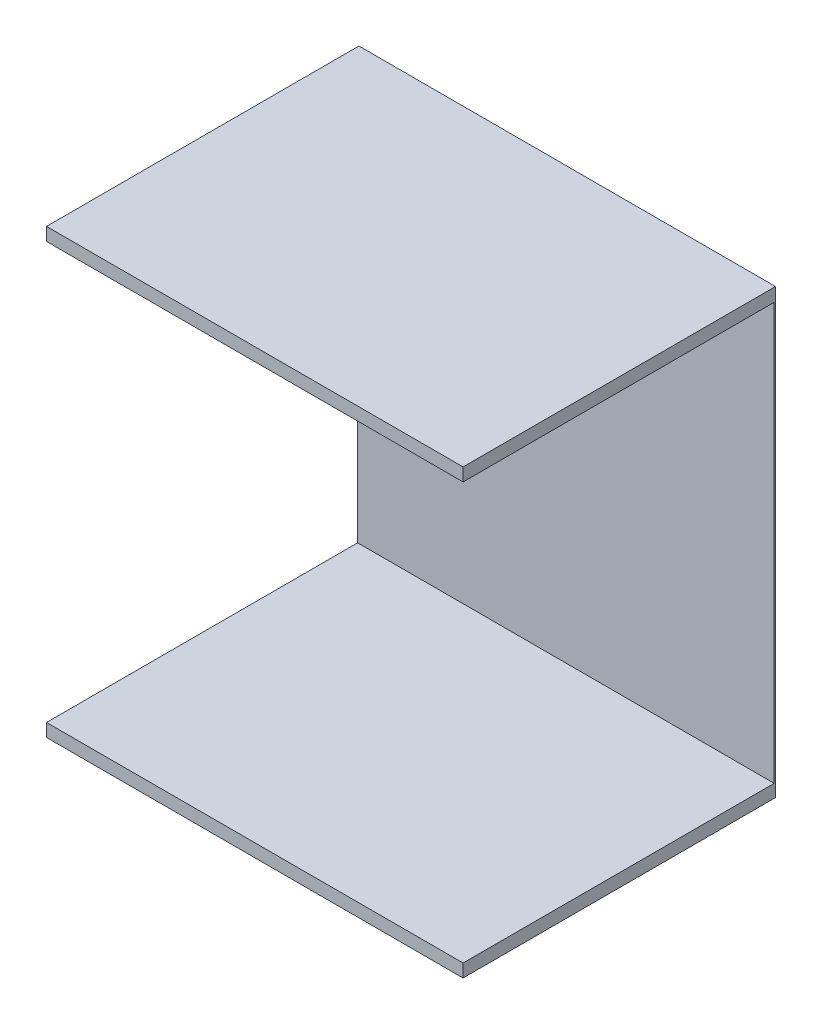
ISO-10303-21;
HEADER;
FILE_DESCRIPTION(('STEP AP214'),'2;1');
FILE_NAME('part.step','',(''),(''),'','','');
FILE_SCHEMA(('AUTOMOTIVE_DESIGN { 1 0 10303 214 1 1 1 1 }'));
ENDSEC;
DATA;
#1=APPLICATION_CONTEXT('core data for automotive mechanical design processes');
#2=APPLICATION_PROTOCOL_DEFINITION('international standard','automotive_design',2000,#1);
#3=PRODUCT_CONTEXT('',#1,'mechanical');
#4=PRODUCT('Part','Part','',(#3));
#5=PRODUCT_RELATED_PRODUCT_CATEGORY('part','',(#4));
#6=PRODUCT_DEFINITION_FORMATION('','',#4);
#7=PRODUCT_DEFINITION_CONTEXT('part definition',#1,'design');
#8=PRODUCT_DEFINITION('design','',#6,#7);
#9=PRODUCT_DEFINITION_SHAPE('','',#8);
#10=(LENGTH_UNIT() NAMED_UNIT(*) SI_UNIT(.MILLI.,.METRE.));
#11=(NAMED_UNIT(*) PLANE_ANGLE_UNIT() SI_UNIT($,.RADIAN.));
#12=(NAMED_UNIT(*) SI_UNIT($,.STERADIAN.) SOLID_ANGLE_UNIT());
#13=UNCERTAINTY_MEASURE_WITH_UNIT(LENGTH_MEASURE(1.E-05),#10,'distance_accuracy_value','');
#14=(GEOMETRIC_REPRESENTATION_CONTEXT(3) GLOBAL_UNCERTAINTY_ASSIGNED_CONTEXT((#13)) GLOBAL_UNIT_ASSIGNED_CONTEXT((#10,
#11,#12)) REPRESENTATION_CONTEXT('',''));
#15=CARTESIAN_POINT('',(0.,0.,0.));
#16=DIRECTION('',(0.,0.,1.));
#17=DIRECTION('',(1.,0.,0.));
#18=AXIS2_PLACEMENT_3D('',#15,#16,#17);
#19=CARTESIAN_POINT('',(0.,0.,152.4));
#20=DIRECTION('',(0.,1.,0.));
#21=DIRECTION('',(-1.,0.,0.));
#22=AXIS2_PLACEMENT_3D('',#19,#20,#21);
#23=PLANE('',#22);
#24=DIRECTION('',(0.,0.,-1.));
#25=VECTOR('',#24,1.);
#26=CARTESIAN_POINT('',(0.,0.,152.4));
#27=LINE('',#26,#25);
#28=CARTESIAN_POINT('',(0.,0.,152.4));
#29=VERTEX_POINT('',#28);
#30=CARTESIAN_POINT('',(0.,0.,0.635000000000052));
#31=VERTEX_POINT('',#30);
#32=EDGE_CURVE('E174',#29,#31,#27,.T.);
#33=ORIENTED_EDGE('',*,*,#32,.T.);
#34=DIRECTION('',(1.,0.,0.));
#35=VECTOR('',#34,1.);
#36=CARTESIAN_POINT('',(0.,0.,0.634999999999997));
#37=LINE('',#36,#35);
#38=CARTESIAN_POINT('',(203.2,0.,0.635000000000052));
#39=VERTEX_POINT('',#38);
#40=EDGE_CURVE('E63',#31,#39,#37,.T.);
#41=ORIENTED_EDGE('',*,*,#40,.T.);
#42=DIRECTION('',(0.,0.,-1.));
#43=VECTOR('',#42,1.);
#44=CARTESIAN_POINT('',(203.2,0.,152.4));
#45=LINE('',#44,#43);
#46=CARTESIAN_POINT('',(203.2,0.,152.4));
#47=VERTEX_POINT('',#46);
#48=EDGE_CURVE('E49',#47,#39,#45,.T.);
#49=ORIENTED_EDGE('',*,*,#48,.F.);
#50=DIRECTION('',(1.,0.,0.));
#51=VECTOR('',#50,1.);
#52=CARTESIAN_POINT('',(0.,0.,152.4));
#53=LINE('',#52,#51);
#54=EDGE_CURVE('E158',#29,#47,#53,.T.);
#55=ORIENTED_EDGE('',*,*,#54,.F.);
#56=EDGE_LOOP('',(#33,#41,#49,#55));
#57=FACE_BOUND('',#56,.T.);
#58=ADVANCED_FACE('F41',(#57),#23,.F.);
#59=CARTESIAN_POINT('',(203.2,0.,152.4));
#60=DIRECTION('',(-1.,0.,0.));
#61=DIRECTION('',(0.,0.,1.));
#62=AXIS2_PLACEMENT_3D('',#59,#60,#61);
#63=PLANE('',#62);
#64=DIRECTION('',(0.,-1.,0.));
#65=VECTOR('',#64,1.);
#66=CARTESIAN_POINT('',(203.2,-209.55,0.635));
#67=LINE('',#66,#65);
#68=CARTESIAN_POINT('',(203.2,-203.2,0.635000000000052));
#69=VERTEX_POINT('',#68);
#70=EDGE_CURVE('E148',#39,#69,#67,.T.);
#71=ORIENTED_EDGE('',*,*,#70,.T.);
#72=DIRECTION('',(0.,0.,-1.));
#73=VECTOR('',#72,1.);
#74=CARTESIAN_POINT('',(203.2,-203.2,152.4));
#75=LINE('',#74,#73);
#76=CARTESIAN_POINT('',(203.2,-203.2,152.4));
#77=VERTEX_POINT('',#76);
#78=EDGE_CURVE('E125',#77,#69,#75,.T.);
#79=ORIENTED_EDGE('',*,*,#78,.F.);
#80=DIRECTION('',(0.,1.,0.));
#81=VECTOR('',#80,1.);
#82=CARTESIAN_POINT('',(203.2,0.,152.4));
#83=LINE('',#82,#81);
#84=CARTESIAN_POINT('',(203.2,-209.55,152.4));
#85=VERTEX_POINT('',#84);
#86=EDGE_CURVE('E122',#85,#77,#83,.T.);
#87=ORIENTED_EDGE('',*,*,#86,.F.);
#88=DIRECTION('',(0.,0.,-1.));
#89=VECTOR('',#88,1.);
#90=CARTESIAN_POINT('',(203.2,-209.55,0.635));
#91=LINE('',#90,#89);
#92=CARTESIAN_POINT('',(203.2,-209.55,0.));
#93=VERTEX_POINT('',#92);
#94=EDGE_CURVE('E108',#85,#93,#91,.T.);
#95=ORIENTED_EDGE('',*,*,#94,.T.);
#96=DIRECTION('',(0.,1.,0.));
#97=VECTOR('',#96,1.);
#98=CARTESIAN_POINT('',(203.2,0.,0.));
#99=LINE('',#98,#97);
#100=CARTESIAN_POINT('',(203.2,6.35,0.));
#101=VERTEX_POINT('',#100);
#102=EDGE_CURVE('E157',#93,#101,#99,.T.);
#103=ORIENTED_EDGE('',*,*,#102,.T.);
#104=DIRECTION('',(0.,0.,-1.));
#105=VECTOR('',#104,1.);
#106=CARTESIAN_POINT('',(203.2,6.35,152.4));
#107=LINE('',#106,#105);
#108=CARTESIAN_POINT('',(203.2,6.35,152.4));
#109=VERTEX_POINT('',#108);
#110=EDGE_CURVE('E189',#109,#101,#107,.T.);
#111=ORIENTED_EDGE('',*,*,#110,.F.);
#112=DIRECTION('',(0.,1.,0.));
#113=VECTOR('',#112,1.);
#114=CARTESIAN_POINT('',(203.2,0.,152.4));
#115=LINE('',#114,#113);
#116=EDGE_CURVE('E162',#47,#109,#115,.T.);
#117=ORIENTED_EDGE('',*,*,#116,.F.);
#118=ORIENTED_EDGE('',*,*,#48,.T.);
#119=EDGE_LOOP('',(#71,#79,#87,#95,#103,#111,#117,#118));
#120=FACE_BOUND('',#119,.T.);
#121=ADVANCED_FACE('F124',(#120),#63,.F.);
#122=CARTESIAN_POINT('',(0.,6.35,152.4));
#123=DIRECTION('',(0.,1.,0.));
#124=DIRECTION('',(0.,0.,1.));
#125=AXIS2_PLACEMENT_3D('',#122,#123,#124);
#126=PLANE('',#125);
#127=ORIENTED_EDGE('',*,*,#110,.T.);
#128=DIRECTION('',(1.,0.,0.));
#129=VECTOR('',#128,1.);
#130=CARTESIAN_POINT('',(0.,6.35,0.));
#131=LINE('',#130,#129);
#132=CARTESIAN_POINT('',(0.,6.35,0.));
#133=VERTEX_POINT('',#132);
#134=EDGE_CURVE('E177',#133,#101,#131,.T.);
#135=ORIENTED_EDGE('',*,*,#134,.F.);
#136=DIRECTION('',(0.,0.,-1.));
#137=VECTOR('',#136,1.);
#138=CARTESIAN_POINT('',(0.,6.35,152.4));
#139=LINE('',#138,#137);
#140=CARTESIAN_POINT('',(0.,6.35,152.4));
#141=VERTEX_POINT('',#140);
#142=EDGE_CURVE('E185',#141,#133,#139,.T.);
#143=ORIENTED_EDGE('',*,*,#142,.F.);
#144=DIRECTION('',(1.,0.,0.));
#145=VECTOR('',#144,1.);
#146=CARTESIAN_POINT('',(0.,6.35,152.4));
#147=LINE('',#146,#145);
#148=EDGE_CURVE('E166',#141,#109,#147,.T.);
#149=ORIENTED_EDGE('',*,*,#148,.T.);
#150=EDGE_LOOP('',(#127,#135,#143,#149));
#151=FACE_BOUND('',#150,.T.);
#152=ADVANCED_FACE('F207',(#151),#126,.T.);
#153=CARTESIAN_POINT('',(0.,0.,152.4));
#154=DIRECTION('',(-1.,0.,0.));
#155=DIRECTION('',(0.,0.,1.));
#156=AXIS2_PLACEMENT_3D('',#153,#154,#155);
#157=PLANE('',#156);
#158=ORIENTED_EDGE('',*,*,#142,.T.);
#159=DIRECTION('',(0.,1.,0.));
#160=VECTOR('',#159,1.);
#161=CARTESIAN_POINT('',(0.,0.,0.));
#162=LINE('',#161,#160);
#163=CARTESIAN_POINT('',(0.,-209.55,0.));
#164=VERTEX_POINT('',#163);
#165=EDGE_CURVE('E163',#164,#133,#162,.T.);
#166=ORIENTED_EDGE('',*,*,#165,.F.);
#167=DIRECTION('',(0.,0.,-1.));
#168=VECTOR('',#167,1.);
#169=CARTESIAN_POINT('',(0.,-209.55,0.635));
#170=LINE('',#169,#168);
#171=CARTESIAN_POINT('',(0.,-209.55,152.4));
#172=VERTEX_POINT('',#171);
#173=EDGE_CURVE('E119',#172,#164,#170,.T.);
#174=ORIENTED_EDGE('',*,*,#173,.F.);
#175=DIRECTION('',(0.,1.,0.));
#176=VECTOR('',#175,1.);
#177=CARTESIAN_POINT('',(0.,0.,152.4));
#178=LINE('',#177,#176);
#179=CARTESIAN_POINT('',(0.,-203.2,152.4));
#180=VERTEX_POINT('',#179);
#181=EDGE_CURVE('E133',#172,#180,#178,.T.);
#182=ORIENTED_EDGE('',*,*,#181,.T.);
#183=DIRECTION('',(0.,0.,-1.));
#184=VECTOR('',#183,1.);
#185=CARTESIAN_POINT('',(0.,-203.2,152.4));
#186=LINE('',#185,#184);
#187=CARTESIAN_POINT('',(0.,-203.2,0.635));
#188=VERTEX_POINT('',#187);
#189=EDGE_CURVE('E56',#180,#188,#186,.T.);
#190=ORIENTED_EDGE('',*,*,#189,.T.);
#191=DIRECTION('',(0.,1.,0.));
#192=VECTOR('',#191,1.);
#193=CARTESIAN_POINT('',(0.,6.35,0.635));
#194=LINE('',#193,#192);
#195=EDGE_CURVE('E145',#188,#31,#194,.T.);
#196=ORIENTED_EDGE('',*,*,#195,.T.);
#197=ORIENTED_EDGE('',*,*,#32,.F.);
#198=DIRECTION('',(0.,1.,0.));
#199=VECTOR('',#198,1.);
#200=CARTESIAN_POINT('',(0.,0.,152.4));
#201=LINE('',#200,#199);
#202=EDGE_CURVE('E170',#29,#141,#201,.T.);
#203=ORIENTED_EDGE('',*,*,#202,.T.);
#204=EDGE_LOOP('',(#158,#166,#174,#182,#190,#196,#197,#203));
#205=FACE_BOUND('',#204,.T.);
#206=ADVANCED_FACE('F202',(#205),#157,.T.);
#207=CARTESIAN_POINT('',(0.,0.,152.4));
#208=DIRECTION('',(0.,0.,1.));
#209=DIRECTION('',(1.,0.,0.));
#210=AXIS2_PLACEMENT_3D('',#207,#208,#209);
#211=PLANE('',#210);
#212=ORIENTED_EDGE('',*,*,#54,.T.);
#213=ORIENTED_EDGE('',*,*,#116,.T.);
#214=ORIENTED_EDGE('',*,*,#148,.F.);
#215=ORIENTED_EDGE('',*,*,#202,.F.);
#216=EDGE_LOOP('',(#212,#213,#214,#215));
#217=FACE_BOUND('',#216,.T.);
#218=ADVANCED_FACE('F211',(#217),#211,.T.);
#219=CARTESIAN_POINT('',(0.,0.,0.));
#220=DIRECTION('',(0.,0.,1.));
#221=DIRECTION('',(1.,0.,0.));
#222=AXIS2_PLACEMENT_3D('',#219,#220,#221);
#223=PLANE('',#222);
#224=ORIENTED_EDGE('',*,*,#134,.T.);
#225=ORIENTED_EDGE('',*,*,#102,.F.);
#226=DIRECTION('',(-1.,0.,0.));
#227=VECTOR('',#226,1.);
#228=CARTESIAN_POINT('',(0.,-209.55,0.));
#229=LINE('',#228,#227);
#230=EDGE_CURVE('E116',#93,#164,#229,.T.);
#231=ORIENTED_EDGE('',*,*,#230,.T.);
#232=ORIENTED_EDGE('',*,*,#165,.T.);
#233=EDGE_LOOP('',(#224,#225,#231,#232));
#234=FACE_BOUND('',#233,.T.);
#235=ADVANCED_FACE('F204',(#234),#223,.F.);
#236=CARTESIAN_POINT('',(0.,0.,0.635));
#237=DIRECTION('',(0.,0.,1.));
#238=DIRECTION('',(1.,0.,0.));
#239=AXIS2_PLACEMENT_3D('',#236,#237,#238);
#240=PLANE('',#239);
#241=DIRECTION('',(-1.,0.,0.));
#242=VECTOR('',#241,1.);
#243=CARTESIAN_POINT('',(0.,-203.2,0.635));
#244=LINE('',#243,#242);
#245=EDGE_CURVE('E11',#69,#188,#244,.T.);
#246=ORIENTED_EDGE('',*,*,#245,.F.);
#247=ORIENTED_EDGE('',*,*,#70,.F.);
#248=ORIENTED_EDGE('',*,*,#40,.F.);
#249=ORIENTED_EDGE('',*,*,#195,.F.);
#250=EDGE_LOOP('',(#246,#247,#248,#249));
#251=FACE_BOUND('',#250,.T.);
#252=ADVANCED_FACE('F198',(#251),#240,.T.);
#253=CARTESIAN_POINT('',(0.,-209.55,0.635));
#254=DIRECTION('',(0.,-1.,0.));
#255=DIRECTION('',(1.,0.,0.));
#256=AXIS2_PLACEMENT_3D('',#253,#254,#255);
#257=PLANE('',#256);
#258=ORIENTED_EDGE('',*,*,#230,.F.);
#259=ORIENTED_EDGE('',*,*,#94,.F.);
#260=DIRECTION('',(1.,0.,0.));
#261=VECTOR('',#260,1.);
#262=CARTESIAN_POINT('',(0.,-209.55,152.4));
#263=LINE('',#262,#261);
#264=EDGE_CURVE('E113',#172,#85,#263,.T.);
#265=ORIENTED_EDGE('',*,*,#264,.F.);
#266=ORIENTED_EDGE('',*,*,#173,.T.);
#267=EDGE_LOOP('',(#258,#259,#265,#266));
#268=FACE_BOUND('',#267,.T.);
#269=ADVANCED_FACE('F110',(#268),#257,.T.);
#270=CARTESIAN_POINT('',(0.,-203.2,152.4));
#271=DIRECTION('',(0.,1.,0.));
#272=DIRECTION('',(0.,0.,1.));
#273=AXIS2_PLACEMENT_3D('',#270,#271,#272);
#274=PLANE('',#273);
#275=ORIENTED_EDGE('',*,*,#78,.T.);
#276=ORIENTED_EDGE('',*,*,#245,.T.);
#277=ORIENTED_EDGE('',*,*,#189,.F.);
#278=DIRECTION('',(1.,0.,0.));
#279=VECTOR('',#278,1.);
#280=CARTESIAN_POINT('',(0.,-203.2,152.4));
#281=LINE('',#280,#279);
#282=EDGE_CURVE('E130',#180,#77,#281,.T.);
#283=ORIENTED_EDGE('',*,*,#282,.T.);
#284=EDGE_LOOP('',(#275,#276,#277,#283));
#285=FACE_BOUND('',#284,.T.);
#286=ADVANCED_FACE('F201',(#285),#274,.T.);
#287=CARTESIAN_POINT('',(0.,0.,152.4));
#288=DIRECTION('',(0.,0.,1.));
#289=DIRECTION('',(1.,0.,0.));
#290=AXIS2_PLACEMENT_3D('',#287,#288,#289);
#291=PLANE('',#290);
#292=ORIENTED_EDGE('',*,*,#264,.T.);
#293=ORIENTED_EDGE('',*,*,#86,.T.);
#294=ORIENTED_EDGE('',*,*,#282,.F.);
#295=ORIENTED_EDGE('',*,*,#181,.F.);
#296=EDGE_LOOP('',(#292,#293,#294,#295));
#297=FACE_BOUND('',#296,.T.);
#298=ADVANCED_FACE('F132',(#297),#291,.T.);
#299=CLOSED_SHELL('',(#58,#121,#152,#206,#218,#235,#252,#269,#286,#298));
#300=MANIFOLD_SOLID_BREP('B2',#299);
#301=ADVANCED_BREP_SHAPE_REPRESENTATION('',(#18,#300),#14);
#302=SHAPE_DEFINITION_REPRESENTATION(#9,#301);
ENDSEC;
END-ISO-10303-21;
